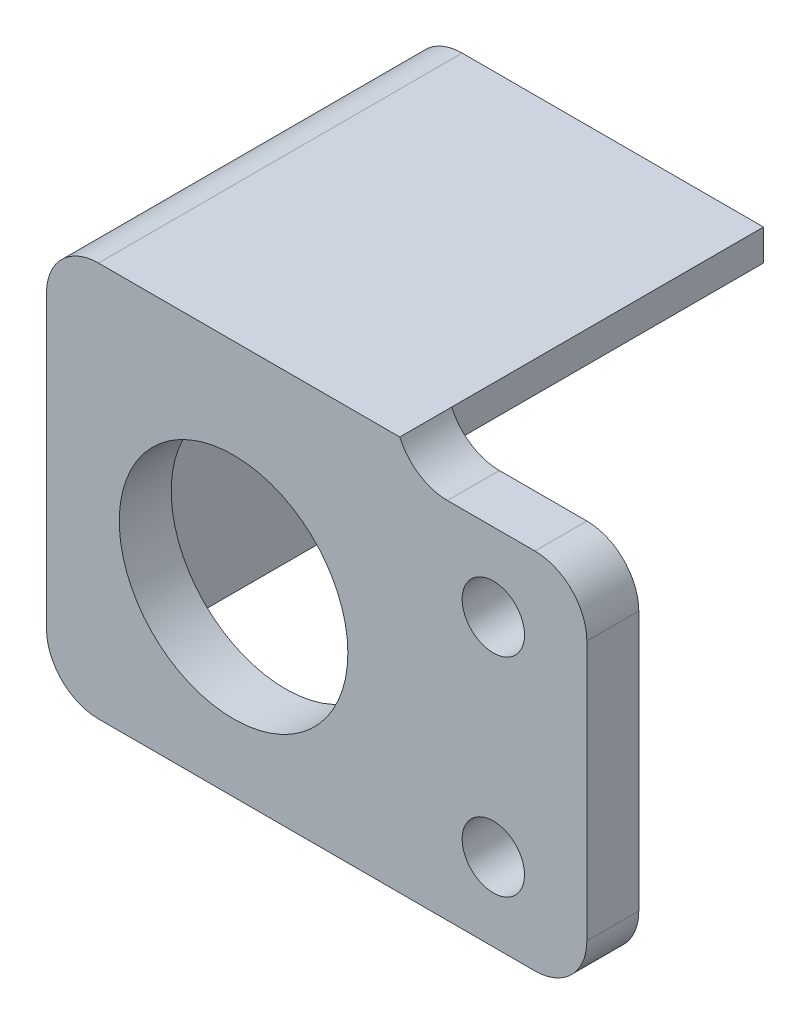
ISO-10303-21;
HEADER;
FILE_DESCRIPTION(('STEP AP214'),'2;1');
FILE_NAME('part.step','',(''),(''),'','','');
FILE_SCHEMA(('AUTOMOTIVE_DESIGN { 1 0 10303 214 1 1 1 1 }'));
ENDSEC;
DATA;
#1=APPLICATION_CONTEXT('core data for automotive mechanical design processes');
#2=APPLICATION_PROTOCOL_DEFINITION('international standard','automotive_design',2000,#1);
#3=PRODUCT_CONTEXT('',#1,'mechanical');
#4=PRODUCT('Part','Part','',(#3));
#5=PRODUCT_RELATED_PRODUCT_CATEGORY('part','',(#4));
#6=PRODUCT_DEFINITION_FORMATION('','',#4);
#7=PRODUCT_DEFINITION_CONTEXT('part definition',#1,'design');
#8=PRODUCT_DEFINITION('design','',#6,#7);
#9=PRODUCT_DEFINITION_SHAPE('','',#8);
#10=(LENGTH_UNIT() NAMED_UNIT(*) SI_UNIT(.MILLI.,.METRE.));
#11=(NAMED_UNIT(*) PLANE_ANGLE_UNIT() SI_UNIT($,.RADIAN.));
#12=(NAMED_UNIT(*) SI_UNIT($,.STERADIAN.) SOLID_ANGLE_UNIT());
#13=UNCERTAINTY_MEASURE_WITH_UNIT(LENGTH_MEASURE(1.E-05),#10,'distance_accuracy_value','');
#14=(GEOMETRIC_REPRESENTATION_CONTEXT(3) GLOBAL_UNCERTAINTY_ASSIGNED_CONTEXT((#13)) GLOBAL_UNIT_ASSIGNED_CONTEXT((#10,
#11,#12)) REPRESENTATION_CONTEXT('',''));
#15=CARTESIAN_POINT('',(0.,0.,0.));
#16=DIRECTION('',(0.,0.,1.));
#17=DIRECTION('',(1.,0.,0.));
#18=AXIS2_PLACEMENT_3D('',#15,#16,#17);
#19=CARTESIAN_POINT('',(-25.,17.5,5.));
#20=DIRECTION('',(0.,-1.,0.));
#21=DIRECTION('',(0.,0.,-1.));
#22=AXIS2_PLACEMENT_3D('',#19,#20,#21);
#23=PLANE('',#22);
#24=DIRECTION('',(-1.,0.,0.));
#25=VECTOR('',#24,1.);
#26=CARTESIAN_POINT('',(-25.,17.5,5.));
#27=LINE('',#26,#25);
#28=CARTESIAN_POINT('',(20.,17.5,5.));
#29=VERTEX_POINT('',#28);
#30=CARTESIAN_POINT('',(11.5825756949558,17.5,5.));
#31=VERTEX_POINT('',#30);
#32=EDGE_CURVE('E145',#29,#31,#27,.T.);
#33=ORIENTED_EDGE('',*,*,#32,.F.);
#34=DIRECTION('',(0.,0.,-1.));
#35=VECTOR('',#34,1.);
#36=CARTESIAN_POINT('',(20.,17.5,5.));
#37=LINE('',#36,#35);
#38=CARTESIAN_POINT('',(20.,17.5,0.));
#39=VERTEX_POINT('',#38);
#40=EDGE_CURVE('E249',#29,#39,#37,.T.);
#41=ORIENTED_EDGE('',*,*,#40,.T.);
#42=DIRECTION('',(-1.,0.,0.));
#43=VECTOR('',#42,1.);
#44=CARTESIAN_POINT('',(-25.,17.5,0.));
#45=LINE('',#44,#43);
#46=CARTESIAN_POINT('',(11.5825756949558,17.5,0.));
#47=VERTEX_POINT('',#46);
#48=EDGE_CURVE('E198',#39,#47,#45,.T.);
#49=ORIENTED_EDGE('',*,*,#48,.T.);
#50=DIRECTION('',(0.,0.,-1.));
#51=VECTOR('',#50,1.);
#52=CARTESIAN_POINT('',(11.5825756949558,17.5,5.));
#53=LINE('',#52,#51);
#54=EDGE_CURVE('E247',#47,#31,#53,.F.);
#55=ORIENTED_EDGE('',*,*,#54,.T.);
#56=EDGE_LOOP('',(#33,#41,#49,#55));
#57=FACE_BOUND('',#56,.T.);
#58=ADVANCED_FACE('F33',(#57),#23,.F.);
#59=CARTESIAN_POINT('',(0.,0.,5.));
#60=DIRECTION('',(0.,0.,1.));
#61=DIRECTION('',(1.,0.,0.));
#62=AXIS2_PLACEMENT_3D('',#59,#60,#61);
#63=PLANE('',#62);
#64=CARTESIAN_POINT('',(16.,10.,5.));
#65=DIRECTION('',(0.,0.,1.));
#66=DIRECTION('',(1.,0.,0.));
#67=AXIS2_PLACEMENT_3D('',#64,#65,#66);
#68=CIRCLE('',#67,3.);
#69=CARTESIAN_POINT('',(19.,10.,5.));
#70=VERTEX_POINT('',#69);
#71=EDGE_CURVE('E174',#70,#70,#68,.T.);
#72=ORIENTED_EDGE('',*,*,#71,.F.);
#73=EDGE_LOOP('',(#72));
#74=FACE_BOUND('',#73,.T.);
#75=DIRECTION('',(0.,1.,0.));
#76=VECTOR('',#75,1.);
#77=CARTESIAN_POINT('',(-27.,20.5,5.));
#78=LINE('',#77,#76);
#79=CARTESIAN_POINT('',(-27.,-12.5,5.));
#80=VERTEX_POINT('',#79);
#81=CARTESIAN_POINT('',(-27.,15.5,5.));
#82=VERTEX_POINT('',#81);
#83=EDGE_CURVE('E309',#80,#82,#78,.T.);
#84=ORIENTED_EDGE('',*,*,#83,.F.);
#85=CARTESIAN_POINT('',(-22.,-12.5,5.));
#86=DIRECTION('',(0.,0.,1.));
#87=DIRECTION('',(1.,0.,0.));
#88=AXIS2_PLACEMENT_3D('',#85,#86,#87);
#89=CIRCLE('',#88,5.);
#90=CARTESIAN_POINT('',(-22.,-17.5,5.));
#91=VERTEX_POINT('',#90);
#92=EDGE_CURVE('E232',#80,#91,#89,.T.);
#93=ORIENTED_EDGE('',*,*,#92,.T.);
#94=DIRECTION('',(1.,0.,0.));
#95=VECTOR('',#94,1.);
#96=CARTESIAN_POINT('',(-25.,-17.5,5.));
#97=LINE('',#96,#95);
#98=CARTESIAN_POINT('',(20.,-17.5,5.));
#99=VERTEX_POINT('',#98);
#100=EDGE_CURVE('E191',#91,#99,#97,.T.);
#101=ORIENTED_EDGE('',*,*,#100,.T.);
#102=CARTESIAN_POINT('',(20.,-12.5,5.));
#103=DIRECTION('',(0.,0.,1.));
#104=DIRECTION('',(1.,0.,0.));
#105=AXIS2_PLACEMENT_3D('',#102,#103,#104);
#106=CIRCLE('',#105,5.);
#107=CARTESIAN_POINT('',(25.,-12.5,5.));
#108=VERTEX_POINT('',#107);
#109=EDGE_CURVE('E228',#99,#108,#106,.T.);
#110=ORIENTED_EDGE('',*,*,#109,.T.);
#111=DIRECTION('',(0.,1.,0.));
#112=VECTOR('',#111,1.);
#113=CARTESIAN_POINT('',(25.,17.5,5.));
#114=LINE('',#113,#112);
#115=CARTESIAN_POINT('',(25.,12.5,5.));
#116=VERTEX_POINT('',#115);
#117=EDGE_CURVE('E186',#108,#116,#114,.T.);
#118=ORIENTED_EDGE('',*,*,#117,.T.);
#119=CARTESIAN_POINT('',(20.,12.5,5.));
#120=DIRECTION('',(0.,0.,1.));
#121=DIRECTION('',(1.,0.,0.));
#122=AXIS2_PLACEMENT_3D('',#119,#120,#121);
#123=CIRCLE('',#122,5.);
#124=EDGE_CURVE('E226',#116,#29,#123,.T.);
#125=ORIENTED_EDGE('',*,*,#124,.T.);
#126=ORIENTED_EDGE('',*,*,#32,.T.);
#127=CARTESIAN_POINT('',(11.5825756949558,22.5,5.));
#128=DIRECTION('',(0.,0.,1.));
#129=DIRECTION('',(1.,0.,0.));
#130=AXIS2_PLACEMENT_3D('',#127,#128,#129);
#131=CIRCLE('',#130,5.);
#132=CARTESIAN_POINT('',(7.,20.5,5.));
#133=VERTEX_POINT('',#132);
#134=EDGE_CURVE('E11',#31,#133,#131,.F.);
#135=ORIENTED_EDGE('',*,*,#134,.T.);
#136=DIRECTION('',(1.,0.,0.));
#137=VECTOR('',#136,1.);
#138=CARTESIAN_POINT('',(0.,20.5,5.));
#139=LINE('',#138,#137);
#140=CARTESIAN_POINT('',(-22.,20.5,5.));
#141=VERTEX_POINT('',#140);
#142=EDGE_CURVE('E142',#141,#133,#139,.T.);
#143=ORIENTED_EDGE('',*,*,#142,.F.);
#144=CARTESIAN_POINT('',(-22.,15.5,5.));
#145=DIRECTION('',(0.,0.,1.));
#146=DIRECTION('',(1.,0.,0.));
#147=AXIS2_PLACEMENT_3D('',#144,#145,#146);
#148=CIRCLE('',#147,5.);
#149=EDGE_CURVE('E230',#141,#82,#148,.T.);
#150=ORIENTED_EDGE('',*,*,#149,.T.);
#151=EDGE_LOOP('',(#84,#93,#101,#110,#118,#125,#126,#135,#143,#150));
#152=FACE_BOUND('',#151,.T.);
#153=CARTESIAN_POINT('',(-9.00000000000001,0.,5.));
#154=DIRECTION('',(0.,0.,1.));
#155=DIRECTION('',(1.,0.,0.));
#156=AXIS2_PLACEMENT_3D('',#153,#154,#155);
#157=CIRCLE('',#156,11.);
#158=CARTESIAN_POINT('',(1.99999999999999,0.,5.));
#159=VERTEX_POINT('',#158);
#160=EDGE_CURVE('E180',#159,#159,#157,.T.);
#161=ORIENTED_EDGE('',*,*,#160,.F.);
#162=EDGE_LOOP('',(#161));
#163=FACE_BOUND('',#162,.T.);
#164=CARTESIAN_POINT('',(16.,-10.,5.));
#165=DIRECTION('',(0.,0.,1.));
#166=DIRECTION('',(-1.,0.,0.));
#167=AXIS2_PLACEMENT_3D('',#164,#165,#166);
#168=CIRCLE('',#167,3.);
#169=CARTESIAN_POINT('',(13.,-10.,5.));
#170=VERTEX_POINT('',#169);
#171=EDGE_CURVE('E168',#170,#170,#168,.T.);
#172=ORIENTED_EDGE('',*,*,#171,.F.);
#173=EDGE_LOOP('',(#172));
#174=FACE_BOUND('',#173,.T.);
#175=ADVANCED_FACE('F140',(#74,#152,#163,#174),#63,.T.);
#176=CARTESIAN_POINT('',(0.,0.,0.));
#177=DIRECTION('',(0.,0.,1.));
#178=DIRECTION('',(1.,0.,0.));
#179=AXIS2_PLACEMENT_3D('',#176,#177,#178);
#180=PLANE('',#179);
#181=DIRECTION('',(0.,-1.,0.));
#182=VECTOR('',#181,1.);
#183=CARTESIAN_POINT('',(-25.,17.5,0.));
#184=LINE('',#183,#182);
#185=CARTESIAN_POINT('',(-25.,12.5,0.));
#186=VERTEX_POINT('',#185);
#187=CARTESIAN_POINT('',(-25.,-16.5,0.));
#188=VERTEX_POINT('',#187);
#189=EDGE_CURVE('E201',#186,#188,#184,.T.);
#190=ORIENTED_EDGE('',*,*,#189,.F.);
#191=CARTESIAN_POINT('',(-20.,12.5,0.));
#192=DIRECTION('',(0.,0.,1.));
#193=DIRECTION('',(1.,0.,0.));
#194=AXIS2_PLACEMENT_3D('',#191,#192,#193);
#195=CIRCLE('',#194,5.);
#196=CARTESIAN_POINT('',(-20.,17.5,0.));
#197=VERTEX_POINT('',#196);
#198=EDGE_CURVE('E218',#186,#197,#195,.F.);
#199=ORIENTED_EDGE('',*,*,#198,.T.);
#200=CARTESIAN_POINT('',(7.,17.5,0.));
#201=VERTEX_POINT('',#200);
#202=EDGE_CURVE('E197',#201,#197,#45,.T.);
#203=ORIENTED_EDGE('',*,*,#202,.F.);
#204=DIRECTION('',(0.,-1.,0.));
#205=VECTOR('',#204,1.);
#206=CARTESIAN_POINT('',(7.,0.,0.));
#207=LINE('',#206,#205);
#208=CARTESIAN_POINT('',(7.,20.5,0.));
#209=VERTEX_POINT('',#208);
#210=EDGE_CURVE('E252',#209,#201,#207,.T.);
#211=ORIENTED_EDGE('',*,*,#210,.F.);
#212=CARTESIAN_POINT('',(11.5825756949558,22.5,0.));
#213=DIRECTION('',(0.,0.,1.));
#214=DIRECTION('',(1.,0.,0.));
#215=AXIS2_PLACEMENT_3D('',#212,#213,#214);
#216=CIRCLE('',#215,5.);
#217=EDGE_CURVE('E41',#209,#47,#216,.T.);
#218=ORIENTED_EDGE('',*,*,#217,.T.);
#219=ORIENTED_EDGE('',*,*,#48,.F.);
#220=CARTESIAN_POINT('',(20.,12.5,0.));
#221=DIRECTION('',(0.,0.,1.));
#222=DIRECTION('',(1.,0.,0.));
#223=AXIS2_PLACEMENT_3D('',#220,#221,#222);
#224=CIRCLE('',#223,5.);
#225=CARTESIAN_POINT('',(25.,12.5,0.));
#226=VERTEX_POINT('',#225);
#227=EDGE_CURVE('E212',#39,#226,#224,.F.);
#228=ORIENTED_EDGE('',*,*,#227,.T.);
#229=DIRECTION('',(0.,1.,0.));
#230=VECTOR('',#229,1.);
#231=CARTESIAN_POINT('',(25.,17.5,0.));
#232=LINE('',#231,#230);
#233=CARTESIAN_POINT('',(25.,-12.5,0.));
#234=VERTEX_POINT('',#233);
#235=EDGE_CURVE('E183',#234,#226,#232,.T.);
#236=ORIENTED_EDGE('',*,*,#235,.F.);
#237=CARTESIAN_POINT('',(20.,-12.5,0.));
#238=DIRECTION('',(0.,0.,1.));
#239=DIRECTION('',(1.,0.,0.));
#240=AXIS2_PLACEMENT_3D('',#237,#238,#239);
#241=CIRCLE('',#240,5.);
#242=CARTESIAN_POINT('',(20.,-17.5,0.));
#243=VERTEX_POINT('',#242);
#244=EDGE_CURVE('E214',#234,#243,#241,.F.);
#245=ORIENTED_EDGE('',*,*,#244,.T.);
#246=DIRECTION('',(1.,0.,0.));
#247=VECTOR('',#246,1.);
#248=CARTESIAN_POINT('',(-25.,-17.5,0.));
#249=LINE('',#248,#247);
#250=CARTESIAN_POINT('',(-22.,-17.5,0.));
#251=VERTEX_POINT('',#250);
#252=EDGE_CURVE('E189',#251,#243,#249,.T.);
#253=ORIENTED_EDGE('',*,*,#252,.F.);
#254=CARTESIAN_POINT('',(-22.,-12.5,0.));
#255=DIRECTION('',(0.,0.,1.));
#256=DIRECTION('',(1.,0.,0.));
#257=AXIS2_PLACEMENT_3D('',#254,#255,#256);
#258=CIRCLE('',#257,5.);
#259=EDGE_CURVE('E216',#251,#188,#258,.F.);
#260=ORIENTED_EDGE('',*,*,#259,.T.);
#261=EDGE_LOOP('',(#190,#199,#203,#211,#218,#219,#228,#236,#245,#253,#260));
#262=FACE_BOUND('',#261,.T.);
#263=CARTESIAN_POINT('',(-9.00000000000001,0.,0.));
#264=DIRECTION('',(0.,0.,1.));
#265=DIRECTION('',(1.,0.,0.));
#266=AXIS2_PLACEMENT_3D('',#263,#264,#265);
#267=CIRCLE('',#266,11.);
#268=CARTESIAN_POINT('',(1.99999999999999,0.,0.));
#269=VERTEX_POINT('',#268);
#270=EDGE_CURVE('E177',#269,#269,#267,.T.);
#271=ORIENTED_EDGE('',*,*,#270,.T.);
#272=EDGE_LOOP('',(#271));
#273=FACE_BOUND('',#272,.T.);
#274=CARTESIAN_POINT('',(16.,10.,0.));
#275=DIRECTION('',(0.,0.,1.));
#276=DIRECTION('',(1.,0.,0.));
#277=AXIS2_PLACEMENT_3D('',#274,#275,#276);
#278=CIRCLE('',#277,3.);
#279=CARTESIAN_POINT('',(19.,10.,0.));
#280=VERTEX_POINT('',#279);
#281=EDGE_CURVE('E171',#280,#280,#278,.T.);
#282=ORIENTED_EDGE('',*,*,#281,.T.);
#283=EDGE_LOOP('',(#282));
#284=FACE_BOUND('',#283,.T.);
#285=CARTESIAN_POINT('',(16.,-10.,0.));
#286=DIRECTION('',(0.,0.,1.));
#287=DIRECTION('',(-1.,0.,0.));
#288=AXIS2_PLACEMENT_3D('',#285,#286,#287);
#289=CIRCLE('',#288,3.);
#290=CARTESIAN_POINT('',(13.,-10.,0.));
#291=VERTEX_POINT('',#290);
#292=EDGE_CURVE('E158',#291,#291,#289,.T.);
#293=ORIENTED_EDGE('',*,*,#292,.T.);
#294=EDGE_LOOP('',(#293));
#295=FACE_BOUND('',#294,.T.);
#296=ADVANCED_FACE('F258',(#262,#273,#284,#295),#180,.F.);
#297=CARTESIAN_POINT('',(25.,17.5,5.));
#298=DIRECTION('',(-1.,0.,0.));
#299=DIRECTION('',(0.,-1.,0.));
#300=AXIS2_PLACEMENT_3D('',#297,#298,#299);
#301=PLANE('',#300);
#302=ORIENTED_EDGE('',*,*,#117,.F.);
#303=DIRECTION('',(0.,0.,-1.));
#304=VECTOR('',#303,1.);
#305=CARTESIAN_POINT('',(25.,-12.5,5.));
#306=LINE('',#305,#304);
#307=EDGE_CURVE('E244',#108,#234,#306,.T.);
#308=ORIENTED_EDGE('',*,*,#307,.T.);
#309=ORIENTED_EDGE('',*,*,#235,.T.);
#310=DIRECTION('',(0.,0.,-1.));
#311=VECTOR('',#310,1.);
#312=CARTESIAN_POINT('',(25.,12.5,5.));
#313=LINE('',#312,#311);
#314=EDGE_CURVE('E242',#226,#116,#313,.F.);
#315=ORIENTED_EDGE('',*,*,#314,.T.);
#316=EDGE_LOOP('',(#302,#308,#309,#315));
#317=FACE_BOUND('',#316,.T.);
#318=ADVANCED_FACE('F271',(#317),#301,.F.);
#319=CARTESIAN_POINT('',(-25.,-17.5,5.));
#320=DIRECTION('',(0.,1.,0.));
#321=DIRECTION('',(0.,0.,1.));
#322=AXIS2_PLACEMENT_3D('',#319,#320,#321);
#323=PLANE('',#322);
#324=ORIENTED_EDGE('',*,*,#100,.F.);
#325=DIRECTION('',(0.,0.,1.));
#326=VECTOR('',#325,1.);
#327=CARTESIAN_POINT('',(-22.,-17.5,-30.));
#328=LINE('',#327,#326);
#329=EDGE_CURVE('E236',#91,#251,#328,.F.);
#330=ORIENTED_EDGE('',*,*,#329,.T.);
#331=ORIENTED_EDGE('',*,*,#252,.T.);
#332=DIRECTION('',(0.,0.,-1.));
#333=VECTOR('',#332,1.);
#334=CARTESIAN_POINT('',(20.,-17.5,5.));
#335=LINE('',#334,#333);
#336=EDGE_CURVE('E234',#243,#99,#335,.F.);
#337=ORIENTED_EDGE('',*,*,#336,.T.);
#338=EDGE_LOOP('',(#324,#330,#331,#337));
#339=FACE_BOUND('',#338,.T.);
#340=ADVANCED_FACE('F281',(#339),#323,.F.);
#341=CARTESIAN_POINT('',(-9.00000000000001,0.,5.));
#342=DIRECTION('',(0.,0.,-1.));
#343=DIRECTION('',(-1.,0.,0.));
#344=AXIS2_PLACEMENT_3D('',#341,#342,#343);
#345=CYLINDRICAL_SURFACE('',#344,11.);
#346=ORIENTED_EDGE('',*,*,#160,.T.);
#347=EDGE_LOOP('',(#346));
#348=FACE_BOUND('',#347,.T.);
#349=ORIENTED_EDGE('',*,*,#270,.F.);
#350=EDGE_LOOP('',(#349));
#351=FACE_BOUND('',#350,.T.);
#352=ADVANCED_FACE('F364',(#348,#351),#345,.F.);
#353=CARTESIAN_POINT('',(16.,10.,5.));
#354=DIRECTION('',(0.,0.,-1.));
#355=DIRECTION('',(-1.,0.,0.));
#356=AXIS2_PLACEMENT_3D('',#353,#354,#355);
#357=CYLINDRICAL_SURFACE('',#356,3.);
#358=ORIENTED_EDGE('',*,*,#71,.T.);
#359=EDGE_LOOP('',(#358));
#360=FACE_BOUND('',#359,.T.);
#361=ORIENTED_EDGE('',*,*,#281,.F.);
#362=EDGE_LOOP('',(#361));
#363=FACE_BOUND('',#362,.T.);
#364=ADVANCED_FACE('F360',(#360,#363),#357,.F.);
#365=CARTESIAN_POINT('',(16.,-10.,5.));
#366=DIRECTION('',(0.,0.,-1.));
#367=DIRECTION('',(-1.,0.,0.));
#368=AXIS2_PLACEMENT_3D('',#365,#366,#367);
#369=CYLINDRICAL_SURFACE('',#368,3.);
#370=ORIENTED_EDGE('',*,*,#171,.T.);
#371=EDGE_LOOP('',(#370));
#372=FACE_BOUND('',#371,.T.);
#373=ORIENTED_EDGE('',*,*,#292,.F.);
#374=EDGE_LOOP('',(#373));
#375=FACE_BOUND('',#374,.T.);
#376=ADVANCED_FACE('F353',(#372,#375),#369,.F.);
#377=CARTESIAN_POINT('',(0.,17.5,0.));
#378=DIRECTION('',(0.,1.,0.));
#379=DIRECTION('',(0.,0.,1.));
#380=AXIS2_PLACEMENT_3D('',#377,#378,#379);
#381=PLANE('',#380);
#382=ORIENTED_EDGE('',*,*,#202,.T.);
#383=DIRECTION('',(0.,0.,-1.));
#384=VECTOR('',#383,1.);
#385=CARTESIAN_POINT('',(-20.,17.5,-30.));
#386=LINE('',#385,#384);
#387=CARTESIAN_POINT('',(-20.,17.5,-30.));
#388=VERTEX_POINT('',#387);
#389=EDGE_CURVE('E194',#197,#388,#386,.T.);
#390=ORIENTED_EDGE('',*,*,#389,.T.);
#391=DIRECTION('',(1.,0.,0.));
#392=VECTOR('',#391,1.);
#393=CARTESIAN_POINT('',(0.,17.5,-30.));
#394=LINE('',#393,#392);
#395=CARTESIAN_POINT('',(7.,17.5,-30.));
#396=VERTEX_POINT('',#395);
#397=EDGE_CURVE('E162',#388,#396,#394,.T.);
#398=ORIENTED_EDGE('',*,*,#397,.T.);
#399=DIRECTION('',(0.,0.,-1.));
#400=VECTOR('',#399,1.);
#401=CARTESIAN_POINT('',(7.,17.5,0.));
#402=LINE('',#401,#400);
#403=EDGE_CURVE('E164',#201,#396,#402,.T.);
#404=ORIENTED_EDGE('',*,*,#403,.F.);
#405=EDGE_LOOP('',(#382,#390,#398,#404));
#406=FACE_BOUND('',#405,.T.);
#407=ADVANCED_FACE('F301',(#406),#381,.F.);
#408=CARTESIAN_POINT('',(0.,20.5,-30.));
#409=DIRECTION('',(0.,0.,-1.));
#410=DIRECTION('',(-1.,0.,0.));
#411=AXIS2_PLACEMENT_3D('',#408,#409,#410);
#412=PLANE('',#411);
#413=DIRECTION('',(0.,-1.,0.));
#414=VECTOR('',#413,1.);
#415=CARTESIAN_POINT('',(-25.,20.5,-30.));
#416=LINE('',#415,#414);
#417=CARTESIAN_POINT('',(-25.,12.5,-30.));
#418=VERTEX_POINT('',#417);
#419=CARTESIAN_POINT('',(-25.,-16.5,-30.));
#420=VERTEX_POINT('',#419);
#421=EDGE_CURVE('E294',#418,#420,#416,.T.);
#422=ORIENTED_EDGE('',*,*,#421,.T.);
#423=CARTESIAN_POINT('',(-22.,-12.5,-30.));
#424=DIRECTION('',(0.,0.,-1.));
#425=DIRECTION('',(-1.,0.,0.));
#426=AXIS2_PLACEMENT_3D('',#423,#424,#425);
#427=CIRCLE('',#426,5.);
#428=CARTESIAN_POINT('',(-27.,-12.5,-30.));
#429=VERTEX_POINT('',#428);
#430=EDGE_CURVE('E239',#420,#429,#427,.T.);
#431=ORIENTED_EDGE('',*,*,#430,.T.);
#432=DIRECTION('',(0.,-1.,0.));
#433=VECTOR('',#432,1.);
#434=CARTESIAN_POINT('',(-27.,20.5,-30.));
#435=LINE('',#434,#433);
#436=CARTESIAN_POINT('',(-27.,15.5,-30.));
#437=VERTEX_POINT('',#436);
#438=EDGE_CURVE('E165',#437,#429,#435,.T.);
#439=ORIENTED_EDGE('',*,*,#438,.F.);
#440=CARTESIAN_POINT('',(-22.,15.5,-30.));
#441=DIRECTION('',(0.,0.,-1.));
#442=DIRECTION('',(-1.,0.,0.));
#443=AXIS2_PLACEMENT_3D('',#440,#441,#442);
#444=CIRCLE('',#443,5.);
#445=CARTESIAN_POINT('',(-22.,20.5,-30.));
#446=VERTEX_POINT('',#445);
#447=EDGE_CURVE('E55',#437,#446,#444,.T.);
#448=ORIENTED_EDGE('',*,*,#447,.T.);
#449=DIRECTION('',(1.,0.,0.));
#450=VECTOR('',#449,1.);
#451=CARTESIAN_POINT('',(0.,20.5,-30.));
#452=LINE('',#451,#450);
#453=CARTESIAN_POINT('',(7.,20.5,-30.));
#454=VERTEX_POINT('',#453);
#455=EDGE_CURVE('E153',#446,#454,#452,.T.);
#456=ORIENTED_EDGE('',*,*,#455,.T.);
#457=DIRECTION('',(0.,-1.,0.));
#458=VECTOR('',#457,1.);
#459=CARTESIAN_POINT('',(7.,20.5,-30.));
#460=LINE('',#459,#458);
#461=EDGE_CURVE('E155',#454,#396,#460,.T.);
#462=ORIENTED_EDGE('',*,*,#461,.T.);
#463=ORIENTED_EDGE('',*,*,#397,.F.);
#464=CARTESIAN_POINT('',(-20.,12.5,-30.));
#465=DIRECTION('',(0.,0.,-1.));
#466=DIRECTION('',(-1.,0.,0.));
#467=AXIS2_PLACEMENT_3D('',#464,#465,#466);
#468=CIRCLE('',#467,5.);
#469=EDGE_CURVE('E254',#388,#418,#468,.F.);
#470=ORIENTED_EDGE('',*,*,#469,.T.);
#471=EDGE_LOOP('',(#422,#431,#439,#448,#456,#462,#463,#470));
#472=FACE_BOUND('',#471,.T.);
#473=ADVANCED_FACE('F306',(#472),#412,.T.);
#474=CARTESIAN_POINT('',(7.,20.5,0.));
#475=DIRECTION('',(-1.,0.,0.));
#476=DIRECTION('',(0.,0.,1.));
#477=AXIS2_PLACEMENT_3D('',#474,#475,#476);
#478=PLANE('',#477);
#479=DIRECTION('',(0.,0.,-1.));
#480=VECTOR('',#479,1.);
#481=CARTESIAN_POINT('',(7.,20.5,0.));
#482=LINE('',#481,#480);
#483=EDGE_CURVE('E152',#209,#454,#482,.T.);
#484=ORIENTED_EDGE('',*,*,#483,.F.);
#485=ORIENTED_EDGE('',*,*,#210,.T.);
#486=ORIENTED_EDGE('',*,*,#403,.T.);
#487=ORIENTED_EDGE('',*,*,#461,.F.);
#488=EDGE_LOOP('',(#484,#485,#486,#487));
#489=FACE_BOUND('',#488,.T.);
#490=ADVANCED_FACE('F305',(#489),#478,.F.);
#491=CARTESIAN_POINT('',(0.,20.5,0.));
#492=DIRECTION('',(0.,1.,0.));
#493=DIRECTION('',(0.,0.,1.));
#494=AXIS2_PLACEMENT_3D('',#491,#492,#493);
#495=PLANE('',#494);
#496=ORIENTED_EDGE('',*,*,#455,.F.);
#497=DIRECTION('',(0.,0.,-1.));
#498=VECTOR('',#497,1.);
#499=CARTESIAN_POINT('',(-22.,20.5,0.));
#500=LINE('',#499,#498);
#501=EDGE_CURVE('E151',#446,#141,#500,.F.);
#502=ORIENTED_EDGE('',*,*,#501,.T.);
#503=ORIENTED_EDGE('',*,*,#142,.T.);
#504=EDGE_CURVE('E149',#133,#209,#482,.T.);
#505=ORIENTED_EDGE('',*,*,#504,.T.);
#506=ORIENTED_EDGE('',*,*,#483,.T.);
#507=EDGE_LOOP('',(#496,#502,#503,#505,#506));
#508=FACE_BOUND('',#507,.T.);
#509=ADVANCED_FACE('F148',(#508),#495,.T.);
#510=CARTESIAN_POINT('',(-25.,0.,0.));
#511=DIRECTION('',(-1.,0.,0.));
#512=DIRECTION('',(0.,-1.,0.));
#513=AXIS2_PLACEMENT_3D('',#510,#511,#512);
#514=PLANE('',#513);
#515=ORIENTED_EDGE('',*,*,#421,.F.);
#516=DIRECTION('',(0.,0.,-1.));
#517=VECTOR('',#516,1.);
#518=CARTESIAN_POINT('',(-25.,12.5,0.));
#519=LINE('',#518,#517);
#520=EDGE_CURVE('E210',#418,#186,#519,.F.);
#521=ORIENTED_EDGE('',*,*,#520,.T.);
#522=ORIENTED_EDGE('',*,*,#189,.T.);
#523=DIRECTION('',(0.,0.,-1.));
#524=VECTOR('',#523,1.);
#525=CARTESIAN_POINT('',(-25.,-16.5,0.));
#526=LINE('',#525,#524);
#527=EDGE_CURVE('E208',#188,#420,#526,.T.);
#528=ORIENTED_EDGE('',*,*,#527,.T.);
#529=EDGE_LOOP('',(#515,#521,#522,#528));
#530=FACE_BOUND('',#529,.T.);
#531=ADVANCED_FACE('F291',(#530),#514,.F.);
#532=CARTESIAN_POINT('',(-27.,0.,0.));
#533=DIRECTION('',(-1.,0.,0.));
#534=DIRECTION('',(0.,-1.,0.));
#535=AXIS2_PLACEMENT_3D('',#532,#533,#534);
#536=PLANE('',#535);
#537=ORIENTED_EDGE('',*,*,#438,.T.);
#538=DIRECTION('',(0.,0.,1.));
#539=VECTOR('',#538,1.);
#540=CARTESIAN_POINT('',(-27.,-12.5,5.));
#541=LINE('',#540,#539);
#542=EDGE_CURVE('E223',#429,#80,#541,.T.);
#543=ORIENTED_EDGE('',*,*,#542,.T.);
#544=ORIENTED_EDGE('',*,*,#83,.T.);
#545=DIRECTION('',(0.,0.,-1.));
#546=VECTOR('',#545,1.);
#547=CARTESIAN_POINT('',(-27.,15.5,0.));
#548=LINE('',#547,#546);
#549=EDGE_CURVE('E220',#82,#437,#548,.T.);
#550=ORIENTED_EDGE('',*,*,#549,.T.);
#551=EDGE_LOOP('',(#537,#543,#544,#550));
#552=FACE_BOUND('',#551,.T.);
#553=ADVANCED_FACE('F315',(#552),#536,.T.);
#554=CARTESIAN_POINT('',(-20.,12.5,0.));
#555=DIRECTION('',(0.,0.,1.));
#556=DIRECTION('',(1.,0.,0.));
#557=AXIS2_PLACEMENT_3D('',#554,#555,#556);
#558=CYLINDRICAL_SURFACE('',#557,5.);
#559=ORIENTED_EDGE('',*,*,#198,.F.);
#560=ORIENTED_EDGE('',*,*,#520,.F.);
#561=ORIENTED_EDGE('',*,*,#469,.F.);
#562=ORIENTED_EDGE('',*,*,#389,.F.);
#563=EDGE_LOOP('',(#559,#560,#561,#562));
#564=FACE_BOUND('',#563,.T.);
#565=ADVANCED_FACE('F296',(#564),#558,.F.);
#566=CARTESIAN_POINT('',(-22.,-12.5,0.));
#567=DIRECTION('',(0.,0.,-1.));
#568=DIRECTION('',(-1.,0.,0.));
#569=AXIS2_PLACEMENT_3D('',#566,#567,#568);
#570=CYLINDRICAL_SURFACE('',#569,5.);
#571=ORIENTED_EDGE('',*,*,#259,.F.);
#572=ORIENTED_EDGE('',*,*,#329,.F.);
#573=ORIENTED_EDGE('',*,*,#92,.F.);
#574=ORIENTED_EDGE('',*,*,#542,.F.);
#575=ORIENTED_EDGE('',*,*,#430,.F.);
#576=ORIENTED_EDGE('',*,*,#527,.F.);
#577=EDGE_LOOP('',(#571,#572,#573,#574,#575,#576));
#578=FACE_BOUND('',#577,.T.);
#579=ADVANCED_FACE('F284',(#578),#570,.T.);
#580=CARTESIAN_POINT('',(-22.,15.5,0.));
#581=DIRECTION('',(0.,0.,-1.));
#582=DIRECTION('',(-1.,0.,0.));
#583=AXIS2_PLACEMENT_3D('',#580,#581,#582);
#584=CYLINDRICAL_SURFACE('',#583,5.);
#585=ORIENTED_EDGE('',*,*,#149,.F.);
#586=ORIENTED_EDGE('',*,*,#501,.F.);
#587=ORIENTED_EDGE('',*,*,#447,.F.);
#588=ORIENTED_EDGE('',*,*,#549,.F.);
#589=EDGE_LOOP('',(#585,#586,#587,#588));
#590=FACE_BOUND('',#589,.T.);
#591=ADVANCED_FACE('F317',(#590),#584,.T.);
#592=CARTESIAN_POINT('',(20.,-12.5,5.));
#593=DIRECTION('',(0.,0.,-1.));
#594=DIRECTION('',(-1.,0.,0.));
#595=AXIS2_PLACEMENT_3D('',#592,#593,#594);
#596=CYLINDRICAL_SURFACE('',#595,5.);
#597=ORIENTED_EDGE('',*,*,#109,.F.);
#598=ORIENTED_EDGE('',*,*,#336,.F.);
#599=ORIENTED_EDGE('',*,*,#244,.F.);
#600=ORIENTED_EDGE('',*,*,#307,.F.);
#601=EDGE_LOOP('',(#597,#598,#599,#600));
#602=FACE_BOUND('',#601,.T.);
#603=ADVANCED_FACE('F275',(#602),#596,.T.);
#604=CARTESIAN_POINT('',(20.,12.5,5.));
#605=DIRECTION('',(0.,0.,-1.));
#606=DIRECTION('',(-1.,0.,0.));
#607=AXIS2_PLACEMENT_3D('',#604,#605,#606);
#608=CYLINDRICAL_SURFACE('',#607,5.);
#609=ORIENTED_EDGE('',*,*,#124,.F.);
#610=ORIENTED_EDGE('',*,*,#314,.F.);
#611=ORIENTED_EDGE('',*,*,#227,.F.);
#612=ORIENTED_EDGE('',*,*,#40,.F.);
#613=EDGE_LOOP('',(#609,#610,#611,#612));
#614=FACE_BOUND('',#613,.T.);
#615=ADVANCED_FACE('F266',(#614),#608,.T.);
#616=CARTESIAN_POINT('',(11.5825756949558,22.5,0.));
#617=DIRECTION('',(0.,0.,-1.));
#618=DIRECTION('',(-1.,0.,0.));
#619=AXIS2_PLACEMENT_3D('',#616,#617,#618);
#620=CYLINDRICAL_SURFACE('',#619,5.);
#621=ORIENTED_EDGE('',*,*,#134,.F.);
#622=ORIENTED_EDGE('',*,*,#54,.F.);
#623=ORIENTED_EDGE('',*,*,#217,.F.);
#624=ORIENTED_EDGE('',*,*,#504,.F.);
#625=EDGE_LOOP('',(#621,#622,#623,#624));
#626=FACE_BOUND('',#625,.T.);
#627=ADVANCED_FACE('F35',(#626),#620,.F.);
#628=CLOSED_SHELL('',(#58,#175,#296,#318,#340,#352,#364,#376,#407,#473,#490,#509,#531,#553,#565,
#579,#591,#603,#615,#627));
#629=MANIFOLD_SOLID_BREP('B2',#628);
#630=ADVANCED_BREP_SHAPE_REPRESENTATION('',(#18,#629),#14);
#631=SHAPE_DEFINITION_REPRESENTATION(#9,#630);
ENDSEC;
END-ISO-10303-21;
